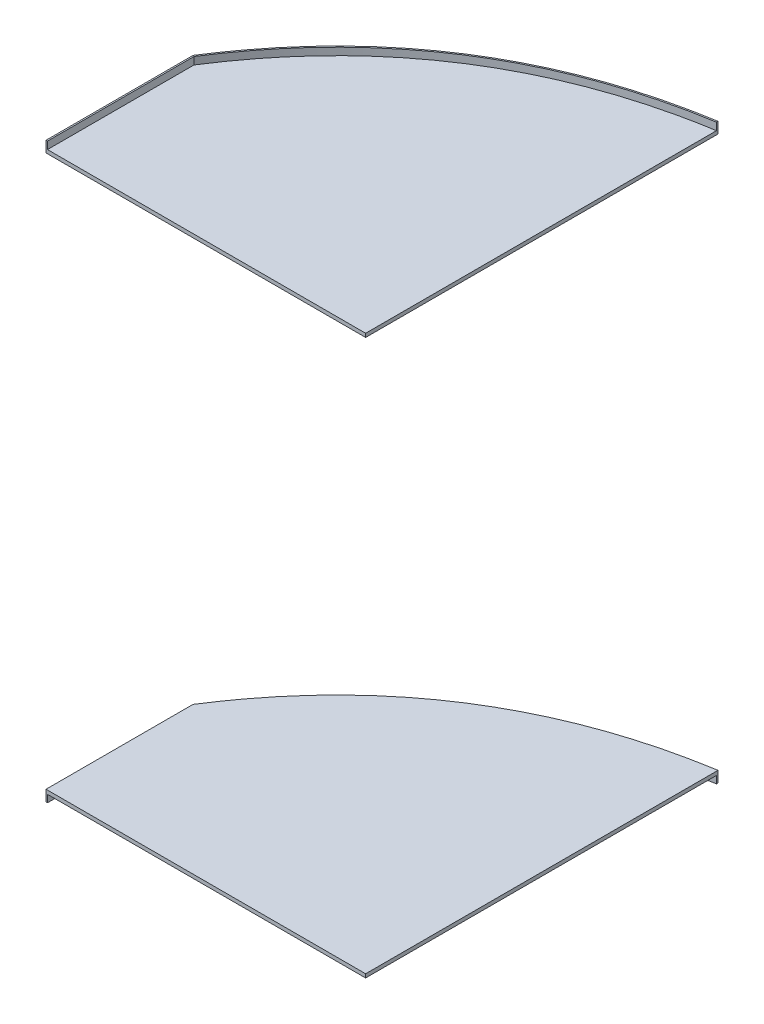
ISO-10303-21;
HEADER;
FILE_DESCRIPTION(('STEP AP214'),'2;1');
FILE_NAME('part.step','',(''),(''),'','','');
FILE_SCHEMA(('AUTOMOTIVE_DESIGN { 1 0 10303 214 1 1 1 1 }'));
ENDSEC;
DATA;
#1=APPLICATION_CONTEXT('core data for automotive mechanical design processes');
#2=APPLICATION_PROTOCOL_DEFINITION('international standard','automotive_design',2000,#1);
#3=PRODUCT_CONTEXT('',#1,'mechanical');
#4=PRODUCT('Part','Part','',(#3));
#5=PRODUCT_RELATED_PRODUCT_CATEGORY('part','',(#4));
#6=PRODUCT_DEFINITION_FORMATION('','',#4);
#7=PRODUCT_DEFINITION_CONTEXT('part definition',#1,'design');
#8=PRODUCT_DEFINITION('design','',#6,#7);
#9=PRODUCT_DEFINITION_SHAPE('','',#8);
#10=(LENGTH_UNIT() NAMED_UNIT(*) SI_UNIT(.MILLI.,.METRE.));
#11=(NAMED_UNIT(*) PLANE_ANGLE_UNIT() SI_UNIT($,.RADIAN.));
#12=(NAMED_UNIT(*) SI_UNIT($,.STERADIAN.) SOLID_ANGLE_UNIT());
#13=UNCERTAINTY_MEASURE_WITH_UNIT(LENGTH_MEASURE(1.E-05),#10,'distance_accuracy_value','');
#14=(GEOMETRIC_REPRESENTATION_CONTEXT(3) GLOBAL_UNCERTAINTY_ASSIGNED_CONTEXT((#13)) GLOBAL_UNIT_ASSIGNED_CONTEXT((#10,
#11,#12)) REPRESENTATION_CONTEXT('',''));
#15=CARTESIAN_POINT('',(0.,0.,0.));
#16=DIRECTION('',(0.,0.,1.));
#17=DIRECTION('',(1.,0.,0.));
#18=AXIS2_PLACEMENT_3D('',#15,#16,#17);
#19=CARTESIAN_POINT('',(625171.31907193,965.2,782339.473305721));
#20=CARTESIAN_POINT('',(-593960.368233357,965.2,-803589.637842524));
#21=CARTESIAN_POINT('',(563850.438841702,965.2,827645.278286817));
#22=B_SPLINE_CURVE_WITH_KNOTS('',2,(#19,#20,#21),.UNSPECIFIED.,.F.,.F.,(3,3),(0.,1.),.UNSPECIFIED.);
#23=DIRECTION('',(0.,-1.,0.));
#24=VECTOR('',#23,1.);
#25=SURFACE_OF_LINEAR_EXTRUSION('',#22,#24);
#26=CARTESIAN_POINT('',(634.379284431262,965.2,556.358432634502));
#27=VERTEX_POINT('',#26);
#28=CARTESIAN_POINT('',(81.9292845400454,965.2,911.433901146012));
#29=VERTEX_POINT('',#28);
#30=EDGE_CURVE('E131',#27,#29,#22,.T.);
#31=ORIENTED_EDGE('',*,*,#30,.F.);
#32=DIRECTION('',(0.,-1.,0.));
#33=VECTOR('',#32,1.);
#34=CARTESIAN_POINT('',(634.379284431253,965.2,556.358432634768));
#35=LINE('',#34,#33);
#36=CARTESIAN_POINT('',(634.379284431253,958.85,556.358432634768));
#37=VERTEX_POINT('',#36);
#38=EDGE_CURVE('E125',#27,#37,#35,.T.);
#39=ORIENTED_EDGE('',*,*,#38,.T.);
#40=CARTESIAN_POINT('',(625171.31907193,958.85,782339.473305721));
#41=CARTESIAN_POINT('',(-593960.368233357,958.85,-803589.637842524));
#42=CARTESIAN_POINT('',(563850.438841702,958.85,827645.278286817));
#43=B_SPLINE_CURVE_WITH_KNOTS('',2,(#40,#41,#42),.UNSPECIFIED.,.F.,.F.,(3,3),(0.,1.),.UNSPECIFIED.);
#44=CARTESIAN_POINT('',(81.9292845400454,958.85,911.433901146012));
#45=VERTEX_POINT('',#44);
#46=EDGE_CURVE('E124',#37,#45,#43,.T.);
#47=ORIENTED_EDGE('',*,*,#46,.T.);
#48=DIRECTION('',(0.,-1.,0.));
#49=VECTOR('',#48,1.);
#50=CARTESIAN_POINT('',(81.9292845400454,965.2,911.433901146012));
#51=LINE('',#50,#49);
#52=EDGE_CURVE('E52',#29,#45,#51,.T.);
#53=ORIENTED_EDGE('',*,*,#52,.F.);
#54=EDGE_LOOP('',(#31,#39,#47,#53));
#55=FACE_BOUND('',#54,.T.);
#56=ADVANCED_FACE('F43',(#55),#25,.F.);
#57=CARTESIAN_POINT('',(81.9292845400454,965.2,911.433901146012));
#58=DIRECTION('',(1.,0.,4.28288200766438E-10));
#59=DIRECTION('',(4.28288200766438E-10,0.,-1.));
#60=AXIS2_PLACEMENT_3D('',#57,#58,#59);
#61=PLANE('',#60);
#62=DIRECTION('',(-4.28288200766438E-10,0.,1.));
#63=VECTOR('',#62,1.);
#64=CARTESIAN_POINT('',(81.9292845400454,958.85,911.433901146012));
#65=LINE('',#64,#63);
#66=CARTESIAN_POINT('',(81.9292844312602,958.85,1165.43390131697));
#67=VERTEX_POINT('',#66);
#68=EDGE_CURVE('E132',#45,#67,#65,.T.);
#69=ORIENTED_EDGE('',*,*,#68,.T.);
#70=DIRECTION('',(0.,-1.,0.));
#71=VECTOR('',#70,1.);
#72=CARTESIAN_POINT('',(81.9292844312602,965.2,1165.43390131697));
#73=LINE('',#72,#71);
#74=CARTESIAN_POINT('',(81.9292844312602,977.9,1165.43390131697));
#75=VERTEX_POINT('',#74);
#76=EDGE_CURVE('E130',#75,#67,#73,.T.);
#77=ORIENTED_EDGE('',*,*,#76,.F.);
#78=DIRECTION('',(4.64982383308548E-12,0.,1.));
#79=VECTOR('',#78,1.);
#80=CARTESIAN_POINT('',(81.9292844300792,977.9,911.43390131858));
#81=LINE('',#80,#79);
#82=CARTESIAN_POINT('',(81.9292844300792,977.9,911.43390131858));
#83=VERTEX_POINT('',#82);
#84=EDGE_CURVE('E272',#83,#75,#81,.T.);
#85=ORIENTED_EDGE('',*,*,#84,.F.);
#86=DIRECTION('',(0.,-1.,0.));
#87=VECTOR('',#86,1.);
#88=CARTESIAN_POINT('',(81.9292844300792,977.9,911.43390131858));
#89=LINE('',#88,#87);
#90=EDGE_CURVE('E175',#83,#29,#89,.T.);
#91=ORIENTED_EDGE('',*,*,#90,.T.);
#92=ORIENTED_EDGE('',*,*,#52,.T.);
#93=EDGE_LOOP('',(#69,#77,#85,#91,#92));
#94=FACE_BOUND('',#93,.T.);
#95=ADVANCED_FACE('F163',(#94),#61,.F.);
#96=CARTESIAN_POINT('',(81.9292844312602,965.2,1165.43390131697));
#97=DIRECTION('',(0.,0.,-1.));
#98=DIRECTION('',(-1.,0.,0.));
#99=AXIS2_PLACEMENT_3D('',#96,#97,#98);
#100=PLANE('',#99);
#101=DIRECTION('',(1.,0.,0.));
#102=VECTOR('',#101,1.);
#103=CARTESIAN_POINT('',(81.9292844312602,958.85,1165.43390131697));
#104=LINE('',#103,#102);
#105=CARTESIAN_POINT('',(634.37928443126,958.85,1165.43390131698));
#106=VERTEX_POINT('',#105);
#107=EDGE_CURVE('E123',#67,#106,#104,.T.);
#108=ORIENTED_EDGE('',*,*,#107,.T.);
#109=DIRECTION('',(0.,1.,0.));
#110=VECTOR('',#109,1.);
#111=CARTESIAN_POINT('',(634.37928443126,-20.2708003875232,1165.43390131698));
#112=LINE('',#111,#110);
#113=CARTESIAN_POINT('',(634.37928443126,965.2,1165.43390131698));
#114=VERTEX_POINT('',#113);
#115=EDGE_CURVE('E107',#106,#114,#112,.T.);
#116=ORIENTED_EDGE('',*,*,#115,.T.);
#117=DIRECTION('',(1.,0.,0.));
#118=VECTOR('',#117,1.);
#119=CARTESIAN_POINT('',(81.9292844312602,965.2,1165.43390131697));
#120=LINE('',#119,#118);
#121=CARTESIAN_POINT('',(84.4693046212217,965.2,1165.43390131697));
#122=VERTEX_POINT('',#121);
#123=EDGE_CURVE('E134',#122,#114,#120,.T.);
#124=ORIENTED_EDGE('',*,*,#123,.F.);
#125=DIRECTION('',(0.,-1.,0.));
#126=VECTOR('',#125,1.);
#127=CARTESIAN_POINT('',(84.4693046212217,977.9,1165.43390131697));
#128=LINE('',#127,#126);
#129=CARTESIAN_POINT('',(84.4693046212217,977.9,1165.43390131697));
#130=VERTEX_POINT('',#129);
#131=EDGE_CURVE('E177',#130,#122,#128,.T.);
#132=ORIENTED_EDGE('',*,*,#131,.F.);
#133=DIRECTION('',(1.,0.,0.));
#134=VECTOR('',#133,1.);
#135=CARTESIAN_POINT('',(81.9292844312602,977.9,1165.43390131697));
#136=LINE('',#135,#134);
#137=EDGE_CURVE('E222',#75,#130,#136,.T.);
#138=ORIENTED_EDGE('',*,*,#137,.F.);
#139=ORIENTED_EDGE('',*,*,#76,.T.);
#140=EDGE_LOOP('',(#108,#116,#124,#132,#138,#139));
#141=FACE_BOUND('',#140,.T.);
#142=ADVANCED_FACE('F128',(#141),#100,.F.);
#143=CARTESIAN_POINT('',(799.47928443126,965.2,567.502499630889));
#144=DIRECTION('',(0.,1.,0.));
#145=DIRECTION('',(0.,0.,1.));
#146=AXIS2_PLACEMENT_3D('',#143,#144,#145);
#147=PLANE('',#146);
#148=DIRECTION('',(0.,0.,1.));
#149=VECTOR('',#148,1.);
#150=CARTESIAN_POINT('',(634.37928443126,965.2,567.502499630889));
#151=LINE('',#150,#149);
#152=CARTESIAN_POINT('',(634.379284431976,965.2,558.931393465035));
#153=VERTEX_POINT('',#152);
#154=EDGE_CURVE('E113',#153,#114,#151,.T.);
#155=ORIENTED_EDGE('',*,*,#154,.F.);
#156=CARTESIAN_POINT('',(84.4693046212217,965.2,912.173507840372));
#157=CARTESIAN_POINT('',(103.445986698,965.2,882.378231606548));
#158=CARTESIAN_POINT('',(124.011412428446,965.2,853.993941632297));
#159=CARTESIAN_POINT('',(168.593594737121,965.2,800.29053861924));
#160=CARTESIAN_POINT('',(192.61009119013,965.2,774.971194559437));
#161=CARTESIAN_POINT('',(224.984358741207,965.2,745.412322476057));
#162=CARTESIAN_POINT('',(236.521490923194,965.2,735.249791870407));
#163=CARTESIAN_POINT('',(248.427624152706,965.2,725.414976441832));
#164=CARTESIAN_POINT('',(255.323064637873,965.2,719.876731411882));
#165=CARTESIAN_POINT('',(257.054292928376,965.2,718.499226904695));
#166=CARTESIAN_POINT('',(272.671395941631,965.2,706.189149425648));
#167=CARTESIAN_POINT('',(286.866852118988,965.2,695.82253197291));
#168=CARTESIAN_POINT('',(330.365972728728,965.2,666.398283488039));
#169=CARTESIAN_POINT('',(360.581983590956,965.2,649.01551165274));
#170=CARTESIAN_POINT('',(407.626608261873,965.2,626.099997010535));
#171=CARTESIAN_POINT('',(423.595021873618,965.2,618.988123553414));
#172=CARTESIAN_POINT('',(447.965802623885,965.2,609.087960016048));
#173=CARTESIAN_POINT('',(460.255741598245,965.2,604.32980554295));
#174=CARTESIAN_POINT('',(472.700305170802,965.2,599.855506436604));
#175=CARTESIAN_POINT('',(481.030802364815,965.2,596.935279590168));
#176=CARTESIAN_POINT('',(485.213538017268,965.2,595.506425963554));
#177=CARTESIAN_POINT('',(506.136959561267,965.2,588.541794096085));
#178=CARTESIAN_POINT('',(522.966553895858,965.2,583.523018506578));
#179=CARTESIAN_POINT('',(556.791975897095,965.2,574.497115080322));
#180=CARTESIAN_POINT('',(573.787817465846,965.2,570.490071847599));
#181=CARTESIAN_POINT('',(605.312882499747,965.2,563.949679137733));
#182=CARTESIAN_POINT('',(619.820459536046,965.2,561.284595784834));
#183=CARTESIAN_POINT('',(634.379270007407,965.2,558.931304229623));
#184=B_SPLINE_CURVE_WITH_KNOTS('',3,(#156,#157,#158,#159,#160,#161,#162,#163,#164,#165,#166,
#167,#168,#169,#170,#171,#172,#173,#174,#175,#176,#177,#178,#179,#180,#181,#182,#183),
.UNSPECIFIED.,.F.,.F.,(4,2,2,1,2,2,2,2,2,1,2,2,2,2,4),(0.,0.125000000000003,0.250000000000005,
0.281250000000006,0.304687500000007,0.312500000000007,0.375000000000006,0.500000000000005,
0.562500000000005,0.593750000000004,0.609375000000004,0.625000000000004,0.687500000000003,
0.750000000000003,0.80291034562062),.UNSPECIFIED.);
#185=CARTESIAN_POINT('',(84.4693046212217,965.2,912.173507840372));
#186=VERTEX_POINT('',#185);
#187=EDGE_CURVE('E143',#186,#153,#184,.T.);
#188=ORIENTED_EDGE('',*,*,#187,.F.);
#189=DIRECTION('',(0.,0.,-1.));
#190=VECTOR('',#189,1.);
#191=CARTESIAN_POINT('',(84.4693046212217,965.2,1165.43390131697));
#192=LINE('',#191,#190);
#193=EDGE_CURVE('E66',#122,#186,#192,.T.);
#194=ORIENTED_EDGE('',*,*,#193,.F.);
#195=ORIENTED_EDGE('',*,*,#123,.T.);
#196=EDGE_LOOP('',(#155,#188,#194,#195));
#197=FACE_BOUND('',#196,.T.);
#198=ADVANCED_FACE('F147',(#197),#147,.T.);
#199=CARTESIAN_POINT('',(799.47928443126,958.85,567.502499630889));
#200=DIRECTION('',(0.,1.,0.));
#201=DIRECTION('',(0.,0.,1.));
#202=AXIS2_PLACEMENT_3D('',#199,#200,#201);
#203=PLANE('',#202);
#204=ORIENTED_EDGE('',*,*,#46,.F.);
#205=DIRECTION('',(0.,0.,1.));
#206=VECTOR('',#205,1.);
#207=CARTESIAN_POINT('',(634.37928443126,958.85,567.502499630889));
#208=LINE('',#207,#206);
#209=EDGE_CURVE('E110',#37,#106,#208,.T.);
#210=ORIENTED_EDGE('',*,*,#209,.T.);
#211=ORIENTED_EDGE('',*,*,#107,.F.);
#212=ORIENTED_EDGE('',*,*,#68,.F.);
#213=EDGE_LOOP('',(#204,#210,#211,#212));
#214=FACE_BOUND('',#213,.T.);
#215=ADVANCED_FACE('F121',(#214),#203,.F.);
#216=CARTESIAN_POINT('',(625171.319071926,977.9,782339.473305724));
#217=CARTESIAN_POINT('',(-593960.368233358,977.9,-803589.637842524));
#218=CARTESIAN_POINT('',(563850.438841707,977.9,827645.278286813));
#219=B_SPLINE_CURVE_WITH_KNOTS('',2,(#216,#217,#218),.UNSPECIFIED.,.F.,.F.,(3,3),(0.,1.),.UNSPECIFIED.);
#220=DIRECTION('',(0.,-1.,0.));
#221=VECTOR('',#220,1.);
#222=SURFACE_OF_LINEAR_EXTRUSION('',#219,#221);
#223=CARTESIAN_POINT('',(634.379284483844,977.9,556.35843262605));
#224=VERTEX_POINT('',#223);
#225=EDGE_CURVE('E268',#224,#83,#219,.T.);
#226=ORIENTED_EDGE('',*,*,#225,.F.);
#227=DIRECTION('',(0.,-1.,0.));
#228=VECTOR('',#227,1.);
#229=CARTESIAN_POINT('',(634.379284431262,977.9,556.358432634502));
#230=LINE('',#229,#228);
#231=EDGE_CURVE('E59',#224,#27,#230,.T.);
#232=ORIENTED_EDGE('',*,*,#231,.T.);
#233=ORIENTED_EDGE('',*,*,#30,.T.);
#234=ORIENTED_EDGE('',*,*,#90,.F.);
#235=EDGE_LOOP('',(#226,#232,#233,#234));
#236=FACE_BOUND('',#235,.T.);
#237=ADVANCED_FACE('F157',(#236),#222,.F.);
#238=CARTESIAN_POINT('',(84.4693046212217,977.9,1165.43390131697));
#239=DIRECTION('',(-1.,0.,0.));
#240=DIRECTION('',(0.,0.,1.));
#241=AXIS2_PLACEMENT_3D('',#238,#239,#240);
#242=PLANE('',#241);
#243=ORIENTED_EDGE('',*,*,#193,.T.);
#244=DIRECTION('',(0.,-1.,0.));
#245=VECTOR('',#244,1.);
#246=CARTESIAN_POINT('',(84.4693046212217,977.9,912.173507840372));
#247=LINE('',#246,#245);
#248=CARTESIAN_POINT('',(84.4693046212217,977.9,912.173507840372));
#249=VERTEX_POINT('',#248);
#250=EDGE_CURVE('E228',#249,#186,#247,.T.);
#251=ORIENTED_EDGE('',*,*,#250,.F.);
#252=DIRECTION('',(0.,0.,-1.));
#253=VECTOR('',#252,1.);
#254=CARTESIAN_POINT('',(84.4693046212217,977.9,1165.43390131697));
#255=LINE('',#254,#253);
#256=EDGE_CURVE('E248',#130,#249,#255,.T.);
#257=ORIENTED_EDGE('',*,*,#256,.F.);
#258=ORIENTED_EDGE('',*,*,#131,.T.);
#259=EDGE_LOOP('',(#243,#251,#257,#258));
#260=FACE_BOUND('',#259,.T.);
#261=ADVANCED_FACE('F211',(#260),#242,.F.);
#262=CARTESIAN_POINT('',(84.4693046212217,977.9,912.173507840372));
#263=CARTESIAN_POINT('',(103.445986698,977.9,882.378231606548));
#264=CARTESIAN_POINT('',(124.011412428446,977.9,853.993941632297));
#265=CARTESIAN_POINT('',(168.593594737121,977.9,800.29053861924));
#266=CARTESIAN_POINT('',(192.61009119013,977.9,774.971194559437));
#267=CARTESIAN_POINT('',(224.984358741207,977.9,745.412322476057));
#268=CARTESIAN_POINT('',(236.521490923194,977.9,735.249791870407));
#269=CARTESIAN_POINT('',(248.427624152706,977.9,725.414976441832));
#270=CARTESIAN_POINT('',(255.323064637873,977.9,719.876731411882));
#271=CARTESIAN_POINT('',(257.054292928376,977.9,718.499226904695));
#272=CARTESIAN_POINT('',(272.671395941631,977.9,706.189149425648));
#273=CARTESIAN_POINT('',(286.866852118988,977.9,695.82253197291));
#274=CARTESIAN_POINT('',(330.365972728728,977.9,666.398283488039));
#275=CARTESIAN_POINT('',(360.581983590956,977.9,649.01551165274));
#276=CARTESIAN_POINT('',(407.626608261873,977.9,626.099997010535));
#277=CARTESIAN_POINT('',(423.595021873618,977.9,618.988123553414));
#278=CARTESIAN_POINT('',(447.965802623885,977.9,609.087960016048));
#279=CARTESIAN_POINT('',(460.255741598245,977.9,604.32980554295));
#280=CARTESIAN_POINT('',(472.700305170802,977.9,599.855506436604));
#281=CARTESIAN_POINT('',(481.030802364815,977.9,596.935279590168));
#282=CARTESIAN_POINT('',(485.213538017268,977.9,595.506425963554));
#283=CARTESIAN_POINT('',(506.136959561267,977.9,588.541794096085));
#284=CARTESIAN_POINT('',(522.966553895858,977.9,583.523018506578));
#285=CARTESIAN_POINT('',(556.791975897095,977.9,574.497115080322));
#286=CARTESIAN_POINT('',(573.787817465846,977.9,570.490071847599));
#287=CARTESIAN_POINT('',(607.932357178009,977.9,563.406226076781));
#288=CARTESIAN_POINT('',(625.081066140156,977.9,560.329489378329));
#289=CARTESIAN_POINT('',(659.519665028817,977.9,555.035202304249));
#290=CARTESIAN_POINT('',(676.809563486671,977.9,552.817703847971));
#291=CARTESIAN_POINT('',(728.875637539389,977.9,547.360312054256));
#292=CARTESIAN_POINT('',(763.847710868159,977.9,545.312595398981));
#293=CARTESIAN_POINT('',(799.046826225048,977.9,544.64659055006));
#294=B_SPLINE_CURVE_WITH_KNOTS('',3,(#262,#263,#264,#265,#266,#267,#268,#269,#270,#271,#272,
#273,#274,#275,#276,#277,#278,#279,#280,#281,#282,#283,#284,#285,#286,#287,#288,#289,#290,#291,
#292,#293),.UNSPECIFIED.,.F.,.F.,(4,2,2,1,2,2,2,2,2,1,2,2,2,2,2,2,4),(0.,0.125000000000003,
0.250000000000005,0.281250000000006,0.304687500000007,0.312500000000007,0.375000000000006,
0.500000000000005,0.562500000000005,0.593750000000004,0.609375000000004,0.625000000000004,
0.687500000000003,0.750000000000003,0.812500000000002,0.875000000000001,1.),.UNSPECIFIED.);
#295=DIRECTION('',(0.,-1.,0.));
#296=VECTOR('',#295,1.);
#297=SURFACE_OF_LINEAR_EXTRUSION('',#294,#296);
#298=ORIENTED_EDGE('',*,*,#187,.T.);
#299=DIRECTION('',(0.,-1.,0.));
#300=VECTOR('',#299,1.);
#301=CARTESIAN_POINT('',(634.37928443126,977.9,558.931301898146));
#302=LINE('',#301,#300);
#303=CARTESIAN_POINT('',(634.379284431466,977.9,558.93139038894));
#304=VERTEX_POINT('',#303);
#305=EDGE_CURVE('E116',#153,#304,#302,.F.);
#306=ORIENTED_EDGE('',*,*,#305,.T.);
#307=CARTESIAN_POINT('',(634.379275138686,977.9,558.931303400201));
#308=CARTESIAN_POINT('',(619.820462944861,977.9,561.284595158625));
#309=CARTESIAN_POINT('',(605.312884197718,977.9,563.949678785461));
#310=CARTESIAN_POINT('',(573.787817465846,977.9,570.490071847599));
#311=CARTESIAN_POINT('',(556.791975897095,977.9,574.497115080322));
#312=CARTESIAN_POINT('',(522.966553895858,977.9,583.523018506578));
#313=CARTESIAN_POINT('',(506.136959561267,977.9,588.541794096085));
#314=CARTESIAN_POINT('',(485.213538017268,977.9,595.506425963554));
#315=CARTESIAN_POINT('',(481.030802364815,977.9,596.935279590168));
#316=CARTESIAN_POINT('',(472.700305170802,977.9,599.855506436604));
#317=CARTESIAN_POINT('',(460.255741598245,977.9,604.32980554295));
#318=CARTESIAN_POINT('',(447.965802623885,977.9,609.087960016048));
#319=CARTESIAN_POINT('',(423.595021873618,977.9,618.988123553414));
#320=CARTESIAN_POINT('',(407.626608261873,977.9,626.099997010535));
#321=CARTESIAN_POINT('',(360.581983590956,977.9,649.01551165274));
#322=CARTESIAN_POINT('',(330.365972728728,977.9,666.398283488039));
#323=CARTESIAN_POINT('',(286.866852118988,977.9,695.82253197291));
#324=CARTESIAN_POINT('',(272.671395941631,977.9,706.189149425648));
#325=CARTESIAN_POINT('',(257.054292928376,977.9,718.499226904695));
#326=CARTESIAN_POINT('',(255.323064637873,977.9,719.876731411882));
#327=CARTESIAN_POINT('',(248.427624152706,977.9,725.414976441832));
#328=CARTESIAN_POINT('',(236.521490923194,977.9,735.249791870407));
#329=CARTESIAN_POINT('',(224.984358741207,977.9,745.412322476057));
#330=CARTESIAN_POINT('',(192.61009119013,977.9,774.971194559437));
#331=CARTESIAN_POINT('',(168.593594737121,977.9,800.29053861924));
#332=CARTESIAN_POINT('',(124.011412428446,977.9,853.993941632297));
#333=CARTESIAN_POINT('',(103.445986698,977.9,882.378231606548));
#334=CARTESIAN_POINT('',(84.4693046212217,977.9,912.173507840372));
#335=B_SPLINE_CURVE_WITH_KNOTS('',3,(#307,#308,#309,#310,#311,#312,#313,#314,#315,#316,#317,
#318,#319,#320,#321,#322,#323,#324,#325,#326,#327,#328,#329,#330,#331,#332,#333,#334),
.UNSPECIFIED.,.F.,.F.,(4,2,2,2,2,1,2,2,2,2,2,1,2,2,4),(0.,0.0529103518367334,0.115410351836733,
0.177910351836732,0.193535351836732,0.209160351836732,0.240410351836732,0.302910351836731,
0.42791035183673,0.490410351836729,0.498222851836729,0.52166035183673,0.552910351836731,
0.677910351836733,0.802910351836736),.UNSPECIFIED.);
#336=EDGE_CURVE('E234',#249,#304,#335,.F.);
#337=ORIENTED_EDGE('',*,*,#336,.F.);
#338=ORIENTED_EDGE('',*,*,#250,.T.);
#339=EDGE_LOOP('',(#298,#306,#337,#338));
#340=FACE_BOUND('',#339,.T.);
#341=ADVANCED_FACE('F200',(#340),#297,.F.);
#342=CARTESIAN_POINT('',(275.255361729023,977.9,701.368976872459));
#343=DIRECTION('',(0.,-1.,0.));
#344=DIRECTION('',(0.,0.,-1.));
#345=AXIS2_PLACEMENT_3D('',#342,#343,#344);
#346=PLANE('',#345);
#347=ORIENTED_EDGE('',*,*,#336,.T.);
#348=DIRECTION('',(0.,0.,-1.));
#349=VECTOR('',#348,1.);
#350=CARTESIAN_POINT('',(634.37928443126,977.9,701.368976872459));
#351=LINE('',#350,#349);
#352=EDGE_CURVE('E12',#304,#224,#351,.T.);
#353=ORIENTED_EDGE('',*,*,#352,.T.);
#354=ORIENTED_EDGE('',*,*,#225,.T.);
#355=ORIENTED_EDGE('',*,*,#84,.T.);
#356=ORIENTED_EDGE('',*,*,#137,.T.);
#357=ORIENTED_EDGE('',*,*,#256,.T.);
#358=EDGE_LOOP('',(#347,#353,#354,#355,#356,#357));
#359=FACE_BOUND('',#358,.T.);
#360=ADVANCED_FACE('F210',(#359),#346,.F.);
#361=CARTESIAN_POINT('',(634.37928443126,-20.2708003875232,1165.43390131698));
#362=DIRECTION('',(-1.,0.,0.));
#363=DIRECTION('',(0.,0.,1.));
#364=AXIS2_PLACEMENT_3D('',#361,#362,#363);
#365=PLANE('',#364);
#366=ORIENTED_EDGE('',*,*,#38,.F.);
#367=ORIENTED_EDGE('',*,*,#231,.F.);
#368=ORIENTED_EDGE('',*,*,#352,.F.);
#369=ORIENTED_EDGE('',*,*,#305,.F.);
#370=ORIENTED_EDGE('',*,*,#154,.T.);
#371=ORIENTED_EDGE('',*,*,#115,.F.);
#372=ORIENTED_EDGE('',*,*,#209,.F.);
#373=EDGE_LOOP('',(#366,#367,#368,#369,#370,#371,#372));
#374=FACE_BOUND('',#373,.T.);
#375=ADVANCED_FACE('F109',(#374),#365,.F.);
#376=CLOSED_SHELL('',(#56,#95,#142,#198,#215,#237,#261,#341,#360,#375));
#377=MANIFOLD_SOLID_BREP('B2',#376);
#378=CARTESIAN_POINT('',(799.47928443126,0.,567.502499630889));
#379=DIRECTION('',(0.,1.,0.));
#380=DIRECTION('',(0.,0.,1.));
#381=AXIS2_PLACEMENT_3D('',#378,#379,#380);
#382=PLANE('',#381);
#383=CARTESIAN_POINT('',(634.379275138392,0.,558.931303400249));
#384=CARTESIAN_POINT('',(619.820462944665,0.,561.284595158661));
#385=CARTESIAN_POINT('',(605.312884197621,0.,563.949678785481));
#386=CARTESIAN_POINT('',(573.787817465846,0.,570.490071847599));
#387=CARTESIAN_POINT('',(556.791975897095,0.,574.497115080322));
#388=CARTESIAN_POINT('',(522.966553895858,0.,583.523018506578));
#389=CARTESIAN_POINT('',(506.136959561267,0.,588.541794096085));
#390=CARTESIAN_POINT('',(485.213538017268,0.,595.506425963554));
#391=CARTESIAN_POINT('',(481.030802364815,0.,596.935279590168));
#392=CARTESIAN_POINT('',(472.700305170802,0.,599.855506436604));
#393=CARTESIAN_POINT('',(468.55211719561,0.,601.346939256009));
#394=CARTESIAN_POINT('',(456.159095508805,0.,605.915857466069));
#395=CARTESIAN_POINT('',(447.965802623885,0.,609.087960016048));
#396=CARTESIAN_POINT('',(423.595021873618,0.,618.988123553414));
#397=CARTESIAN_POINT('',(407.626608261873,0.,626.099997010535));
#398=CARTESIAN_POINT('',(360.581983590956,0.,649.01551165274));
#399=CARTESIAN_POINT('',(330.365972728728,0.,666.398283488039));
#400=CARTESIAN_POINT('',(286.866852118988,0.,695.82253197291));
#401=CARTESIAN_POINT('',(272.671395941631,0.,706.189149425648));
#402=CARTESIAN_POINT('',(257.054292928376,0.,718.499226904695));
#403=CARTESIAN_POINT('',(255.323064637873,0.,719.876731411882));
#404=CARTESIAN_POINT('',(251.875344395289,0.,722.645853926857));
#405=CARTESIAN_POINT('',(246.726748811874,0.,726.819950815898));
#406=CARTESIAN_POINT('',(241.646710976895,0.,731.054934834715));
#407=CARTESIAN_POINT('',(231.577006450545,0.,739.605162794463));
#408=CARTESIAN_POINT('',(224.984358741207,0.,745.412322476057));
#409=CARTESIAN_POINT('',(192.61009119013,0.,774.971194559437));
#410=CARTESIAN_POINT('',(168.593594737121,0.,800.29053861924));
#411=CARTESIAN_POINT('',(124.011412428446,0.,853.993941632297));
#412=CARTESIAN_POINT('',(103.445986698,0.,882.378231606548));
#413=CARTESIAN_POINT('',(84.4693046212217,0.,912.173507840372));
#414=B_SPLINE_CURVE_WITH_KNOTS('',3,(#383,#384,#385,#386,#387,#388,#389,#390,#391,#392,#393,
#394,#395,#396,#397,#398,#399,#400,#401,#402,#403,#404,#405,#406,#407,#408,#409,#410,#411,#412,
#413),.UNSPECIFIED.,.F.,.F.,(4,2,2,2,2,2,2,2,2,2,2,1,2,2,2,4),(0.19708964816362,
0.249999999999997,0.312499999999997,0.374999999999996,0.390624999999996,0.406249999999996,
0.437499999999995,0.499999999999995,0.624999999999994,0.687499999999993,0.695312499999993,
0.703124999999993,0.718749999999994,0.749999999999995,0.874999999999997,1.),.UNSPECIFIED.);
#415=CARTESIAN_POINT('',(634.379284431673,0.,558.931360891948));
#416=VERTEX_POINT('',#415);
#417=CARTESIAN_POINT('',(84.4693046212217,0.,912.173507840372));
#418=VERTEX_POINT('',#417);
#419=EDGE_CURVE('E375',#416,#418,#414,.T.);
#420=ORIENTED_EDGE('',*,*,#419,.F.);
#421=DIRECTION('',(0.,0.,1.));
#422=VECTOR('',#421,1.);
#423=CARTESIAN_POINT('',(634.37928443126,0.,567.502499630889));
#424=LINE('',#423,#422);
#425=CARTESIAN_POINT('',(634.37928443126,0.,1165.43390131698));
#426=VERTEX_POINT('',#425);
#427=EDGE_CURVE('E420',#416,#426,#424,.T.);
#428=ORIENTED_EDGE('',*,*,#427,.T.);
#429=DIRECTION('',(1.,0.,0.));
#430=VECTOR('',#429,1.);
#431=CARTESIAN_POINT('',(89.6101129923479,0.,1165.43390131697));
#432=LINE('',#431,#430);
#433=CARTESIAN_POINT('',(84.4693046212217,0.,1165.43390131697));
#434=VERTEX_POINT('',#433);
#435=EDGE_CURVE('E429',#434,#426,#432,.T.);
#436=ORIENTED_EDGE('',*,*,#435,.F.);
#437=DIRECTION('',(0.,0.,1.));
#438=VECTOR('',#437,1.);
#439=CARTESIAN_POINT('',(84.4693046212217,0.,1162.89390093496));
#440=LINE('',#439,#438);
#441=EDGE_CURVE('E549',#418,#434,#440,.T.);
#442=ORIENTED_EDGE('',*,*,#441,.F.);
#443=EDGE_LOOP('',(#420,#428,#436,#442));
#444=FACE_BOUND('',#443,.T.);
#445=ADVANCED_FACE('F351',(#444),#382,.F.);
#446=CARTESIAN_POINT('',(625171.319071935,6.35,782339.473305717));
#447=CARTESIAN_POINT('',(-593960.368233358,6.35,-803589.637842524));
#448=CARTESIAN_POINT('',(563850.438841696,6.35,827645.278286821));
#449=B_SPLINE_CURVE_WITH_KNOTS('',2,(#446,#447,#448),.UNSPECIFIED.,.F.,.F.,(3,3),(0.,1.),.UNSPECIFIED.);
#450=DIRECTION('',(0.,-1.,0.));
#451=VECTOR('',#450,1.);
#452=SURFACE_OF_LINEAR_EXTRUSION('',#449,#451);
#453=CARTESIAN_POINT('',(634.379284431255,6.35,556.358432634641));
#454=VERTEX_POINT('',#453);
#455=CARTESIAN_POINT('',(81.9292844312602,6.35,911.433901316977));
#456=VERTEX_POINT('',#455);
#457=EDGE_CURVE('E438',#454,#456,#449,.T.);
#458=ORIENTED_EDGE('',*,*,#457,.F.);
#459=DIRECTION('',(0.,-1.,0.));
#460=VECTOR('',#459,1.);
#461=CARTESIAN_POINT('',(634.379284431255,6.35,556.358432634641));
#462=LINE('',#461,#460);
#463=CARTESIAN_POINT('',(634.379284431262,0.,556.358432634672));
#464=VERTEX_POINT('',#463);
#465=EDGE_CURVE('E431',#454,#464,#462,.T.);
#466=ORIENTED_EDGE('',*,*,#465,.T.);
#467=CARTESIAN_POINT('',(625171.319071935,0.,782339.473305717));
#468=CARTESIAN_POINT('',(-593960.368233358,0.,-803589.637842524));
#469=CARTESIAN_POINT('',(563850.438841696,0.,827645.278286821));
#470=B_SPLINE_CURVE_WITH_KNOTS('',2,(#467,#468,#469),.UNSPECIFIED.,.F.,.F.,(3,3),(0.,1.),.UNSPECIFIED.);
#471=CARTESIAN_POINT('',(81.9292844312602,0.,911.433901316977));
#472=VERTEX_POINT('',#471);
#473=EDGE_CURVE('E439',#464,#472,#470,.T.);
#474=ORIENTED_EDGE('',*,*,#473,.T.);
#475=DIRECTION('',(0.,-1.,0.));
#476=VECTOR('',#475,1.);
#477=CARTESIAN_POINT('',(81.9292844312602,6.35,911.433901316977));
#478=LINE('',#477,#476);
#479=EDGE_CURVE('E362',#456,#472,#478,.T.);
#480=ORIENTED_EDGE('',*,*,#479,.F.);
#481=EDGE_LOOP('',(#458,#466,#474,#480));
#482=FACE_BOUND('',#481,.T.);
#483=ADVANCED_FACE('F353',(#482),#452,.F.);
#484=CARTESIAN_POINT('',(81.9292844312602,6.35,911.433901316977));
#485=DIRECTION('',(1.,0.,0.));
#486=DIRECTION('',(0.,0.,-1.));
#487=AXIS2_PLACEMENT_3D('',#484,#485,#486);
#488=PLANE('',#487);
#489=ORIENTED_EDGE('',*,*,#479,.T.);
#490=DIRECTION('',(0.,1.,0.));
#491=VECTOR('',#490,1.);
#492=CARTESIAN_POINT('',(81.9292844312602,-12.7,911.433901316977));
#493=LINE('',#492,#491);
#494=CARTESIAN_POINT('',(81.9292844312602,-12.7,911.433901316977));
#495=VERTEX_POINT('',#494);
#496=EDGE_CURVE('E482',#495,#472,#493,.T.);
#497=ORIENTED_EDGE('',*,*,#496,.F.);
#498=DIRECTION('',(0.,0.,-1.));
#499=VECTOR('',#498,1.);
#500=CARTESIAN_POINT('',(81.9292844312602,-12.7,1165.43390131697));
#501=LINE('',#500,#499);
#502=CARTESIAN_POINT('',(81.9292844312602,-12.7,1165.43390131697));
#503=VERTEX_POINT('',#502);
#504=EDGE_CURVE('E492',#503,#495,#501,.T.);
#505=ORIENTED_EDGE('',*,*,#504,.F.);
#506=DIRECTION('',(0.,-1.,0.));
#507=VECTOR('',#506,1.);
#508=CARTESIAN_POINT('',(81.9292844312602,6.35,1165.43390131697));
#509=LINE('',#508,#507);
#510=CARTESIAN_POINT('',(81.9292844312602,6.35,1165.43390131697));
#511=VERTEX_POINT('',#510);
#512=EDGE_CURVE('E448',#511,#503,#509,.T.);
#513=ORIENTED_EDGE('',*,*,#512,.F.);
#514=DIRECTION('',(0.,0.,1.));
#515=VECTOR('',#514,1.);
#516=CARTESIAN_POINT('',(81.9292844312602,6.35,911.433901316977));
#517=LINE('',#516,#515);
#518=EDGE_CURVE('E441',#456,#511,#517,.T.);
#519=ORIENTED_EDGE('',*,*,#518,.F.);
#520=EDGE_LOOP('',(#489,#497,#505,#513,#519));
#521=FACE_BOUND('',#520,.T.);
#522=ADVANCED_FACE('F470',(#521),#488,.F.);
#523=CARTESIAN_POINT('',(89.6101129923479,6.35,1165.43390131697));
#524=DIRECTION('',(0.,0.,-1.));
#525=DIRECTION('',(-1.,0.,0.));
#526=AXIS2_PLACEMENT_3D('',#523,#524,#525);
#527=PLANE('',#526);
#528=ORIENTED_EDGE('',*,*,#435,.T.);
#529=DIRECTION('',(0.,1.,0.));
#530=VECTOR('',#529,1.);
#531=CARTESIAN_POINT('',(634.37928443126,-20.2708003875232,1165.43390131698));
#532=LINE('',#531,#530);
#533=CARTESIAN_POINT('',(634.37928443126,6.35,1165.43390131698));
#534=VERTEX_POINT('',#533);
#535=EDGE_CURVE('E417',#426,#534,#532,.T.);
#536=ORIENTED_EDGE('',*,*,#535,.T.);
#537=DIRECTION('',(1.,0.,0.));
#538=VECTOR('',#537,1.);
#539=CARTESIAN_POINT('',(81.9292844312602,6.35,1165.43390131697));
#540=LINE('',#539,#538);
#541=EDGE_CURVE('E450',#511,#534,#540,.T.);
#542=ORIENTED_EDGE('',*,*,#541,.F.);
#543=ORIENTED_EDGE('',*,*,#512,.T.);
#544=DIRECTION('',(-1.,0.,0.));
#545=VECTOR('',#544,1.);
#546=CARTESIAN_POINT('',(84.4693046212217,-12.7,1165.43390131697));
#547=LINE('',#546,#545);
#548=CARTESIAN_POINT('',(84.4693046212217,-12.7,1165.43390131697));
#549=VERTEX_POINT('',#548);
#550=EDGE_CURVE('E495',#549,#503,#547,.T.);
#551=ORIENTED_EDGE('',*,*,#550,.F.);
#552=DIRECTION('',(0.,1.,0.));
#553=VECTOR('',#552,1.);
#554=CARTESIAN_POINT('',(84.4693046212217,-12.7,1165.43390131697));
#555=LINE('',#554,#553);
#556=EDGE_CURVE('E437',#549,#434,#555,.T.);
#557=ORIENTED_EDGE('',*,*,#556,.T.);
#558=EDGE_LOOP('',(#528,#536,#542,#543,#551,#557));
#559=FACE_BOUND('',#558,.T.);
#560=ADVANCED_FACE('F434',(#559),#527,.F.);
#561=CARTESIAN_POINT('',(799.47928443126,6.35,567.502499630889));
#562=DIRECTION('',(0.,1.,0.));
#563=DIRECTION('',(0.,0.,1.));
#564=AXIS2_PLACEMENT_3D('',#561,#562,#563);
#565=PLANE('',#564);
#566=DIRECTION('',(0.,0.,1.));
#567=VECTOR('',#566,1.);
#568=CARTESIAN_POINT('',(634.37928443126,6.35,567.502499630889));
#569=LINE('',#568,#567);
#570=EDGE_CURVE('E422',#454,#534,#569,.T.);
#571=ORIENTED_EDGE('',*,*,#570,.F.);
#572=ORIENTED_EDGE('',*,*,#457,.T.);
#573=ORIENTED_EDGE('',*,*,#518,.T.);
#574=ORIENTED_EDGE('',*,*,#541,.T.);
#575=EDGE_LOOP('',(#571,#572,#573,#574));
#576=FACE_BOUND('',#575,.T.);
#577=ADVANCED_FACE('F467',(#576),#565,.T.);
#578=CARTESIAN_POINT('',(563850.438841707,-12.7,827645.278286813));
#579=CARTESIAN_POINT('',(-593960.368233358,-12.7,-803589.637842524));
#580=CARTESIAN_POINT('',(625171.319071926,-12.7,782339.473305724));
#581=B_SPLINE_CURVE_WITH_KNOTS('',2,(#578,#579,#580),.UNSPECIFIED.,.F.,.F.,(3,3),(0.,1.),.UNSPECIFIED.);
#582=DIRECTION('',(0.,1.,0.));
#583=VECTOR('',#582,1.);
#584=SURFACE_OF_LINEAR_EXTRUSION('',#581,#583);
#585=ORIENTED_EDGE('',*,*,#473,.F.);
#586=DIRECTION('',(0.,1.,0.));
#587=VECTOR('',#586,1.);
#588=CARTESIAN_POINT('',(634.379284431262,-12.7,556.358432634672));
#589=LINE('',#588,#587);
#590=CARTESIAN_POINT('',(634.37928443126,-12.7,556.358432626138));
#591=VERTEX_POINT('',#590);
#592=EDGE_CURVE('E560',#464,#591,#589,.F.);
#593=ORIENTED_EDGE('',*,*,#592,.T.);
#594=EDGE_CURVE('E491',#495,#591,#581,.T.);
#595=ORIENTED_EDGE('',*,*,#594,.F.);
#596=ORIENTED_EDGE('',*,*,#496,.T.);
#597=EDGE_LOOP('',(#585,#593,#595,#596));
#598=FACE_BOUND('',#597,.T.);
#599=ADVANCED_FACE('F488',(#598),#584,.F.);
#600=CARTESIAN_POINT('',(799.046826225048,-12.7,544.64659055006));
#601=CARTESIAN_POINT('',(763.847710868159,-12.7,545.312595398981));
#602=CARTESIAN_POINT('',(728.875637539389,-12.7,547.360312054256));
#603=CARTESIAN_POINT('',(676.809563486671,-12.7,552.817703847971));
#604=CARTESIAN_POINT('',(659.519665028817,-12.7,555.035202304249));
#605=CARTESIAN_POINT('',(625.081066140156,-12.7,560.329489378329));
#606=CARTESIAN_POINT('',(607.932357178009,-12.7,563.406226076781));
#607=CARTESIAN_POINT('',(573.787817465846,-12.7,570.490071847599));
#608=CARTESIAN_POINT('',(556.791975897095,-12.7,574.497115080322));
#609=CARTESIAN_POINT('',(522.966553895858,-12.7,583.523018506578));
#610=CARTESIAN_POINT('',(506.136959561267,-12.7,588.541794096085));
#611=CARTESIAN_POINT('',(485.213538017268,-12.7,595.506425963554));
#612=CARTESIAN_POINT('',(481.030802364815,-12.7,596.935279590168));
#613=CARTESIAN_POINT('',(472.700305170802,-12.7,599.855506436604));
#614=CARTESIAN_POINT('',(468.55211719561,-12.7,601.346939256009));
#615=CARTESIAN_POINT('',(456.159095508805,-12.7,605.915857466069));
#616=CARTESIAN_POINT('',(447.965802623885,-12.7,609.087960016048));
#617=CARTESIAN_POINT('',(423.595021873618,-12.7,618.988123553414));
#618=CARTESIAN_POINT('',(407.626608261873,-12.7,626.099997010535));
#619=CARTESIAN_POINT('',(360.581983590956,-12.7,649.01551165274));
#620=CARTESIAN_POINT('',(330.365972728728,-12.7,666.398283488039));
#621=CARTESIAN_POINT('',(286.866852118988,-12.7,695.82253197291));
#622=CARTESIAN_POINT('',(272.671395941631,-12.7,706.189149425648));
#623=CARTESIAN_POINT('',(257.054292928376,-12.7,718.499226904695));
#624=CARTESIAN_POINT('',(255.323064637873,-12.7,719.876731411882));
#625=CARTESIAN_POINT('',(251.875344395289,-12.7,722.645853926857));
#626=CARTESIAN_POINT('',(246.726748811874,-12.7,726.819950815898));
#627=CARTESIAN_POINT('',(241.646710976895,-12.7,731.054934834715));
#628=CARTESIAN_POINT('',(231.577006450545,-12.7,739.605162794463));
#629=CARTESIAN_POINT('',(224.984358741207,-12.7,745.412322476057));
#630=CARTESIAN_POINT('',(192.61009119013,-12.7,774.971194559437));
#631=CARTESIAN_POINT('',(168.593594737121,-12.7,800.29053861924));
#632=CARTESIAN_POINT('',(124.011412428446,-12.7,853.993941632297));
#633=CARTESIAN_POINT('',(103.445986698,-12.7,882.378231606548));
#634=CARTESIAN_POINT('',(84.4693046212217,-12.7,912.173507840372));
#635=B_SPLINE_CURVE_WITH_KNOTS('',3,(#600,#601,#602,#603,#604,#605,#606,#607,#608,#609,#610,
#611,#612,#613,#614,#615,#616,#617,#618,#619,#620,#621,#622,#623,#624,#625,#626,#627,#628,#629,
#630,#631,#632,#633,#634),.UNSPECIFIED.,.F.,.F.,(4,2,2,2,2,2,2,2,2,2,2,2,2,1,2,2,2,4),(0.,
0.124999999999999,0.187499999999998,0.249999999999997,0.312499999999997,0.374999999999996,
0.390624999999996,0.406249999999996,0.437499999999995,0.499999999999995,0.624999999999994,
0.687499999999993,0.695312499999993,0.703124999999993,0.718749999999994,0.749999999999995,
0.874999999999997,1.),.UNSPECIFIED.);
#636=DIRECTION('',(0.,1.,0.));
#637=VECTOR('',#636,1.);
#638=SURFACE_OF_LINEAR_EXTRUSION('',#635,#637);
#639=CARTESIAN_POINT('',(84.4693046212217,-12.7,912.173507840372));
#640=CARTESIAN_POINT('',(103.445986698,-12.7,882.378231606548));
#641=CARTESIAN_POINT('',(124.011412428446,-12.7,853.993941632297));
#642=CARTESIAN_POINT('',(168.593594737121,-12.7,800.29053861924));
#643=CARTESIAN_POINT('',(192.61009119013,-12.7,774.971194559437));
#644=CARTESIAN_POINT('',(224.984358741207,-12.7,745.412322476057));
#645=CARTESIAN_POINT('',(231.577006450545,-12.7,739.605162794463));
#646=CARTESIAN_POINT('',(241.646710976895,-12.7,731.054934834715));
#647=CARTESIAN_POINT('',(246.726748811874,-12.7,726.819950815898));
#648=CARTESIAN_POINT('',(251.875344395289,-12.7,722.645853926857));
#649=CARTESIAN_POINT('',(255.323064637873,-12.7,719.876731411882));
#650=CARTESIAN_POINT('',(257.054292928376,-12.7,718.499226904695));
#651=CARTESIAN_POINT('',(272.671395941631,-12.7,706.189149425648));
#652=CARTESIAN_POINT('',(286.866852118988,-12.7,695.82253197291));
#653=CARTESIAN_POINT('',(330.365972728728,-12.7,666.398283488039));
#654=CARTESIAN_POINT('',(360.581983590956,-12.7,649.01551165274));
#655=CARTESIAN_POINT('',(407.626608261873,-12.7,626.099997010535));
#656=CARTESIAN_POINT('',(423.595021873618,-12.7,618.988123553414));
#657=CARTESIAN_POINT('',(447.965802623885,-12.7,609.087960016048));
#658=CARTESIAN_POINT('',(456.159095508805,-12.7,605.915857466069));
#659=CARTESIAN_POINT('',(468.55211719561,-12.7,601.346939256009));
#660=CARTESIAN_POINT('',(472.700305170802,-12.7,599.855506436604));
#661=CARTESIAN_POINT('',(481.030802364815,-12.7,596.935279590168));
#662=CARTESIAN_POINT('',(485.213538017268,-12.7,595.506425963554));
#663=CARTESIAN_POINT('',(506.136959561267,-12.7,588.541794096085));
#664=CARTESIAN_POINT('',(522.966553895858,-12.7,583.523018506578));
#665=CARTESIAN_POINT('',(556.791975897095,-12.7,574.497115080322));
#666=CARTESIAN_POINT('',(573.787817465846,-12.7,570.490071847599));
#667=CARTESIAN_POINT('',(605.312883063652,-12.7,563.949679020741));
#668=CARTESIAN_POINT('',(619.820460668131,-12.7,561.284595576867));
#669=CARTESIAN_POINT('',(634.379271711531,-12.7,558.931303954168));
#670=B_SPLINE_CURVE_WITH_KNOTS('',3,(#639,#640,#641,#642,#643,#644,#645,#646,#647,#648,#649,
#650,#651,#652,#653,#654,#655,#656,#657,#658,#659,#660,#661,#662,#663,#664,#665,#666,#667,#668,
#669),.UNSPECIFIED.,.F.,.F.,(4,2,2,2,1,2,2,2,2,2,2,2,2,2,2,4),(0.197089652314975,
0.322089652314978,0.44708965231498,0.478339652314981,0.493964652314982,0.501777152314982,
0.509589652314982,0.572089652314981,0.69708965231498,0.75958965231498,0.790839652314979,
0.806464652314979,0.822089652314979,0.884589652314978,0.947089652314978,1.),.UNSPECIFIED.);
#671=CARTESIAN_POINT('',(634.379284431565,-12.7,558.931423025266));
#672=VERTEX_POINT('',#671);
#673=CARTESIAN_POINT('',(84.4693046212217,-12.7,912.173507840372));
#674=VERTEX_POINT('',#673);
#675=EDGE_CURVE('E538',#672,#674,#670,.F.);
#676=ORIENTED_EDGE('',*,*,#675,.F.);
#677=DIRECTION('',(0.,1.,0.));
#678=VECTOR('',#677,1.);
#679=CARTESIAN_POINT('',(634.37928443126,-12.7,558.931301898146));
#680=LINE('',#679,#678);
#681=EDGE_CURVE('E370',#672,#416,#680,.T.);
#682=ORIENTED_EDGE('',*,*,#681,.T.);
#683=ORIENTED_EDGE('',*,*,#419,.T.);
#684=DIRECTION('',(0.,1.,0.));
#685=VECTOR('',#684,1.);
#686=CARTESIAN_POINT('',(84.4693046212217,-12.7,912.173507840372));
#687=LINE('',#686,#685);
#688=EDGE_CURVE('E442',#674,#418,#687,.T.);
#689=ORIENTED_EDGE('',*,*,#688,.F.);
#690=EDGE_LOOP('',(#676,#682,#683,#689));
#691=FACE_BOUND('',#690,.T.);
#692=ADVANCED_FACE('F519',(#691),#638,.F.);
#693=CARTESIAN_POINT('',(84.4693046212217,-12.7,1162.89390093496));
#694=DIRECTION('',(-1.,0.,0.));
#695=DIRECTION('',(0.,0.,1.));
#696=AXIS2_PLACEMENT_3D('',#693,#694,#695);
#697=PLANE('',#696);
#698=ORIENTED_EDGE('',*,*,#441,.T.);
#699=ORIENTED_EDGE('',*,*,#556,.F.);
#700=DIRECTION('',(0.,0.,1.));
#701=VECTOR('',#700,1.);
#702=CARTESIAN_POINT('',(84.4693046212217,-12.7,1162.89390093496));
#703=LINE('',#702,#701);
#704=EDGE_CURVE('E537',#674,#549,#703,.T.);
#705=ORIENTED_EDGE('',*,*,#704,.F.);
#706=ORIENTED_EDGE('',*,*,#688,.T.);
#707=EDGE_LOOP('',(#698,#699,#705,#706));
#708=FACE_BOUND('',#707,.T.);
#709=ADVANCED_FACE('F516',(#708),#697,.F.);
#710=CARTESIAN_POINT('',(275.255361729279,-12.7,701.368976872544));
#711=DIRECTION('',(0.,1.,0.));
#712=DIRECTION('',(0.,0.,1.));
#713=AXIS2_PLACEMENT_3D('',#710,#711,#712);
#714=PLANE('',#713);
#715=ORIENTED_EDGE('',*,*,#594,.T.);
#716=DIRECTION('',(0.,0.,1.));
#717=VECTOR('',#716,1.);
#718=CARTESIAN_POINT('',(634.37928443126,-12.7,701.368976872544));
#719=LINE('',#718,#717);
#720=EDGE_CURVE('E41',#591,#672,#719,.T.);
#721=ORIENTED_EDGE('',*,*,#720,.T.);
#722=ORIENTED_EDGE('',*,*,#675,.T.);
#723=ORIENTED_EDGE('',*,*,#704,.T.);
#724=ORIENTED_EDGE('',*,*,#550,.T.);
#725=ORIENTED_EDGE('',*,*,#504,.T.);
#726=EDGE_LOOP('',(#715,#721,#722,#723,#724,#725));
#727=FACE_BOUND('',#726,.T.);
#728=ADVANCED_FACE('F506',(#727),#714,.F.);
#729=CARTESIAN_POINT('',(634.37928443126,-20.2708003875232,1165.43390131698));
#730=DIRECTION('',(-1.,0.,0.));
#731=DIRECTION('',(0.,0.,1.));
#732=AXIS2_PLACEMENT_3D('',#729,#730,#731);
#733=PLANE('',#732);
#734=ORIENTED_EDGE('',*,*,#570,.T.);
#735=ORIENTED_EDGE('',*,*,#535,.F.);
#736=ORIENTED_EDGE('',*,*,#427,.F.);
#737=ORIENTED_EDGE('',*,*,#681,.F.);
#738=ORIENTED_EDGE('',*,*,#720,.F.);
#739=ORIENTED_EDGE('',*,*,#592,.F.);
#740=ORIENTED_EDGE('',*,*,#465,.F.);
#741=EDGE_LOOP('',(#734,#735,#736,#737,#738,#739,#740));
#742=FACE_BOUND('',#741,.T.);
#743=ADVANCED_FACE('F419',(#742),#733,.F.);
#744=CLOSED_SHELL('',(#445,#483,#522,#560,#577,#599,#692,#709,#728,#743));
#745=MANIFOLD_SOLID_BREP('B6',#744);
#746=ADVANCED_BREP_SHAPE_REPRESENTATION('',(#18,#377,#745),#14);
#747=SHAPE_DEFINITION_REPRESENTATION(#9,#746);
ENDSEC;
END-ISO-10303-21;
